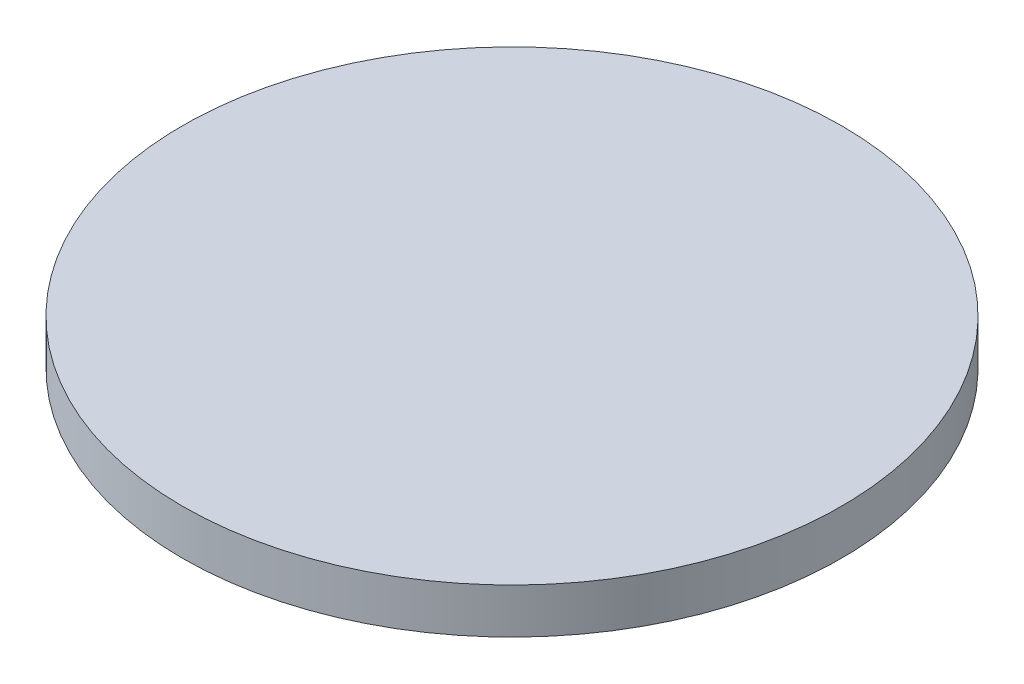
ISO-10303-21;
HEADER;
FILE_DESCRIPTION(('STEP AP214'),'2;1');
FILE_NAME('part.step','',(''),(''),'','','');
FILE_SCHEMA(('AUTOMOTIVE_DESIGN { 1 0 10303 214 1 1 1 1 }'));
ENDSEC;
DATA;
#1=APPLICATION_CONTEXT('core data for automotive mechanical design processes');
#2=APPLICATION_PROTOCOL_DEFINITION('international standard','automotive_design',2000,#1);
#3=PRODUCT_CONTEXT('',#1,'mechanical');
#4=PRODUCT('Part','Part','',(#3));
#5=PRODUCT_RELATED_PRODUCT_CATEGORY('part','',(#4));
#6=PRODUCT_DEFINITION_FORMATION('','',#4);
#7=PRODUCT_DEFINITION_CONTEXT('part definition',#1,'design');
#8=PRODUCT_DEFINITION('design','',#6,#7);
#9=PRODUCT_DEFINITION_SHAPE('','',#8);
#10=(LENGTH_UNIT() NAMED_UNIT(*) SI_UNIT(.MILLI.,.METRE.));
#11=(NAMED_UNIT(*) PLANE_ANGLE_UNIT() SI_UNIT($,.RADIAN.));
#12=(NAMED_UNIT(*) SI_UNIT($,.STERADIAN.) SOLID_ANGLE_UNIT());
#13=UNCERTAINTY_MEASURE_WITH_UNIT(LENGTH_MEASURE(1.E-05),#10,'distance_accuracy_value','');
#14=(GEOMETRIC_REPRESENTATION_CONTEXT(3) GLOBAL_UNCERTAINTY_ASSIGNED_CONTEXT((#13)) GLOBAL_UNIT_ASSIGNED_CONTEXT((#10,
#11,#12)) REPRESENTATION_CONTEXT('',''));
#15=CARTESIAN_POINT('',(0.,0.,0.));
#16=DIRECTION('',(0.,0.,1.));
#17=DIRECTION('',(1.,0.,0.));
#18=AXIS2_PLACEMENT_3D('',#15,#16,#17);
#19=CARTESIAN_POINT('',(0.,2.38125,0.));
#20=DIRECTION('',(0.,-1.,0.));
#21=DIRECTION('',(0.,0.,-1.));
#22=AXIS2_PLACEMENT_3D('',#19,#20,#21);
#23=CYLINDRICAL_SURFACE('',#22,17.399);
#24=CARTESIAN_POINT('',(0.,2.38125,0.));
#25=DIRECTION('',(0.,1.,0.));
#26=DIRECTION('',(0.,0.,1.));
#27=AXIS2_PLACEMENT_3D('',#24,#25,#26);
#28=CIRCLE('',#27,17.399);
#29=CARTESIAN_POINT('',(0.,2.38125,-17.399));
#30=VERTEX_POINT('',#29);
#31=EDGE_CURVE('E10',#30,#30,#28,.T.);
#32=CARTESIAN_POINT('',(0.,0.,0.));
#33=DIRECTION('',(0.,1.,0.));
#34=DIRECTION('',(0.,0.,1.));
#35=AXIS2_PLACEMENT_3D('',#32,#33,#34);
#36=CIRCLE('',#35,17.399);
#37=CARTESIAN_POINT('',(0.,0.,-17.399));
#38=VERTEX_POINT('',#37);
#39=EDGE_CURVE('E34',#38,#38,#36,.T.);
#40=CARTESIAN_POINT('',(0.,2.38125,-17.399));
#41=CARTESIAN_POINT('',(0.,2.3564453125,-17.399));
#42=CARTESIAN_POINT('',(0.,2.331640625,-17.399));
#43=CARTESIAN_POINT('',(0.,2.28203125,-17.399));
#44=CARTESIAN_POINT('',(0.,2.2572265625,-17.399));
#45=CARTESIAN_POINT('',(0.,2.2076171875,-17.399));
#46=CARTESIAN_POINT('',(0.,2.1828125,-17.399));
#47=CARTESIAN_POINT('',(0.,2.133203125,-17.399));
#48=CARTESIAN_POINT('',(0.,2.1083984375,-17.399));
#49=CARTESIAN_POINT('',(0.,2.0587890625,-17.399));
#50=CARTESIAN_POINT('',(0.,2.033984375,-17.399));
#51=CARTESIAN_POINT('',(0.,1.984375,-17.399));
#52=CARTESIAN_POINT('',(0.,1.9595703125,-17.399));
#53=CARTESIAN_POINT('',(0.,1.9099609375,-17.399));
#54=CARTESIAN_POINT('',(0.,1.88515625,-17.399));
#55=CARTESIAN_POINT('',(0.,1.835546875,-17.399));
#56=CARTESIAN_POINT('',(0.,1.8107421875,-17.399));
#57=CARTESIAN_POINT('',(0.,1.7611328125,-17.399));
#58=CARTESIAN_POINT('',(0.,1.736328125,-17.399));
#59=CARTESIAN_POINT('',(0.,1.68671875,-17.399));
#60=CARTESIAN_POINT('',(0.,1.6619140625,-17.399));
#61=CARTESIAN_POINT('',(0.,1.6123046875,-17.399));
#62=CARTESIAN_POINT('',(0.,1.5875,-17.399));
#63=CARTESIAN_POINT('',(0.,1.537890625,-17.399));
#64=CARTESIAN_POINT('',(0.,1.5130859375,-17.399));
#65=CARTESIAN_POINT('',(0.,1.4634765625,-17.399));
#66=CARTESIAN_POINT('',(0.,1.438671875,-17.399));
#67=CARTESIAN_POINT('',(0.,1.3890625,-17.399));
#68=CARTESIAN_POINT('',(0.,1.3642578125,-17.399));
#69=CARTESIAN_POINT('',(0.,1.3146484375,-17.399));
#70=CARTESIAN_POINT('',(0.,1.28984375,-17.399));
#71=CARTESIAN_POINT('',(0.,1.240234375,-17.399));
#72=CARTESIAN_POINT('',(0.,1.2154296875,-17.399));
#73=CARTESIAN_POINT('',(0.,1.1658203125,-17.399));
#74=CARTESIAN_POINT('',(0.,1.141015625,-17.399));
#75=CARTESIAN_POINT('',(0.,1.09140625,-17.399));
#76=CARTESIAN_POINT('',(0.,1.0666015625,-17.399));
#77=CARTESIAN_POINT('',(0.,1.0169921875,-17.399));
#78=CARTESIAN_POINT('',(0.,0.9921875,-17.399));
#79=CARTESIAN_POINT('',(0.,0.942578125,-17.399));
#80=CARTESIAN_POINT('',(0.,0.9177734375,-17.399));
#81=CARTESIAN_POINT('',(0.,0.8681640625,-17.399));
#82=CARTESIAN_POINT('',(0.,0.843359375,-17.399));
#83=CARTESIAN_POINT('',(0.,0.79375,-17.399));
#84=CARTESIAN_POINT('',(0.,0.7689453125,-17.399));
#85=CARTESIAN_POINT('',(0.,0.7193359375,-17.399));
#86=CARTESIAN_POINT('',(0.,0.69453125,-17.399));
#87=CARTESIAN_POINT('',(0.,0.644921875,-17.399));
#88=CARTESIAN_POINT('',(0.,0.6201171875,-17.399));
#89=CARTESIAN_POINT('',(0.,0.5705078125,-17.399));
#90=CARTESIAN_POINT('',(0.,0.545703125,-17.399));
#91=CARTESIAN_POINT('',(0.,0.49609375,-17.399));
#92=CARTESIAN_POINT('',(0.,0.4712890625,-17.399));
#93=CARTESIAN_POINT('',(0.,0.4216796875,-17.399));
#94=CARTESIAN_POINT('',(0.,0.396875,-17.399));
#95=CARTESIAN_POINT('',(0.,0.347265625,-17.399));
#96=CARTESIAN_POINT('',(0.,0.3224609375,-17.399));
#97=CARTESIAN_POINT('',(0.,0.2728515625,-17.399));
#98=CARTESIAN_POINT('',(0.,0.248046875,-17.399));
#99=CARTESIAN_POINT('',(0.,0.1984375,-17.399));
#100=CARTESIAN_POINT('',(0.,0.1736328125,-17.399));
#101=CARTESIAN_POINT('',(0.,0.1240234375,-17.399));
#102=CARTESIAN_POINT('',(0.,0.0992187500000001,-17.399));
#103=CARTESIAN_POINT('',(0.,0.049609375,-17.399));
#104=CARTESIAN_POINT('',(0.,0.0248046875,-17.399));
#105=CARTESIAN_POINT('',(0.,0.,-17.399));
#106=B_SPLINE_CURVE_WITH_KNOTS('',3,(#40,#41,#42,#43,#44,#45,#46,#47,#48,#49,#50,#51,#52,#53,
#54,#55,#56,#57,#58,#59,#60,#61,#62,#63,#64,#65,#66,#67,#68,#69,#70,#71,#72,#73,#74,#75,#76,#77,
#78,#79,#80,#81,#82,#83,#84,#85,#86,#87,#88,#89,#90,#91,#92,#93,#94,#95,#96,#97,#98,#99,#100,
#101,#102,#103,#104,#105),.UNSPECIFIED.,.F.,.F.,(4,2,2,2,2,2,2,2,2,2,2,2,2,2,2,2,2,2,2,2,2,2,2,
2,2,2,2,2,2,2,2,2,4),(0.,0.0744140624999996,0.148828125,0.2232421875,0.29765625,0.3720703125,
0.446484375,0.5208984375,0.5953125,0.6697265625,0.744140625,0.8185546875,0.89296875,
0.9673828125,1.041796875,1.1162109375,1.190625,1.2650390625,1.339453125,1.4138671875,1.48828125,
1.5626953125,1.637109375,1.7115234375,1.7859375,1.8603515625,1.934765625,2.0091796875,
2.08359375,2.1580078125,2.232421875,2.3068359375,2.38125),.UNSPECIFIED.);
#107=EDGE_CURVE('BSEAM31',#30,#38,#106,.T.);
#108=ORIENTED_EDGE('',*,*,#31,.F.);
#109=ORIENTED_EDGE('',*,*,#39,.T.);
#110=ORIENTED_EDGE('',*,*,#107,.T.);
#111=ORIENTED_EDGE('',*,*,#107,.F.);
#112=EDGE_LOOP('',(#108,#110,#109,#111));
#113=FACE_BOUND('',#112,.T.);
#114=ADVANCED_FACE('F31',(#113),#23,.T.);
#115=CARTESIAN_POINT('',(0.,2.38125,0.));
#116=DIRECTION('',(0.,1.,0.));
#117=DIRECTION('',(0.,0.,1.));
#118=AXIS2_PLACEMENT_3D('',#115,#116,#117);
#119=PLANE('',#118);
#120=ORIENTED_EDGE('',*,*,#31,.T.);
#121=EDGE_LOOP('',(#120));
#122=FACE_BOUND('',#121,.T.);
#123=ADVANCED_FACE('F46',(#122),#119,.T.);
#124=CARTESIAN_POINT('',(0.,0.,0.));
#125=DIRECTION('',(0.,1.,0.));
#126=DIRECTION('',(0.,0.,1.));
#127=AXIS2_PLACEMENT_3D('',#124,#125,#126);
#128=PLANE('',#127);
#129=ORIENTED_EDGE('',*,*,#39,.F.);
#130=EDGE_LOOP('',(#129));
#131=FACE_BOUND('',#130,.T.);
#132=ADVANCED_FACE('F44',(#131),#128,.F.);
#133=CLOSED_SHELL('',(#114,#123,#132));
#134=MANIFOLD_SOLID_BREP('B2',#133);
#135=ADVANCED_BREP_SHAPE_REPRESENTATION('',(#18,#134),#14);
#136=SHAPE_DEFINITION_REPRESENTATION(#9,#135);
ENDSEC;
END-ISO-10303-21;
